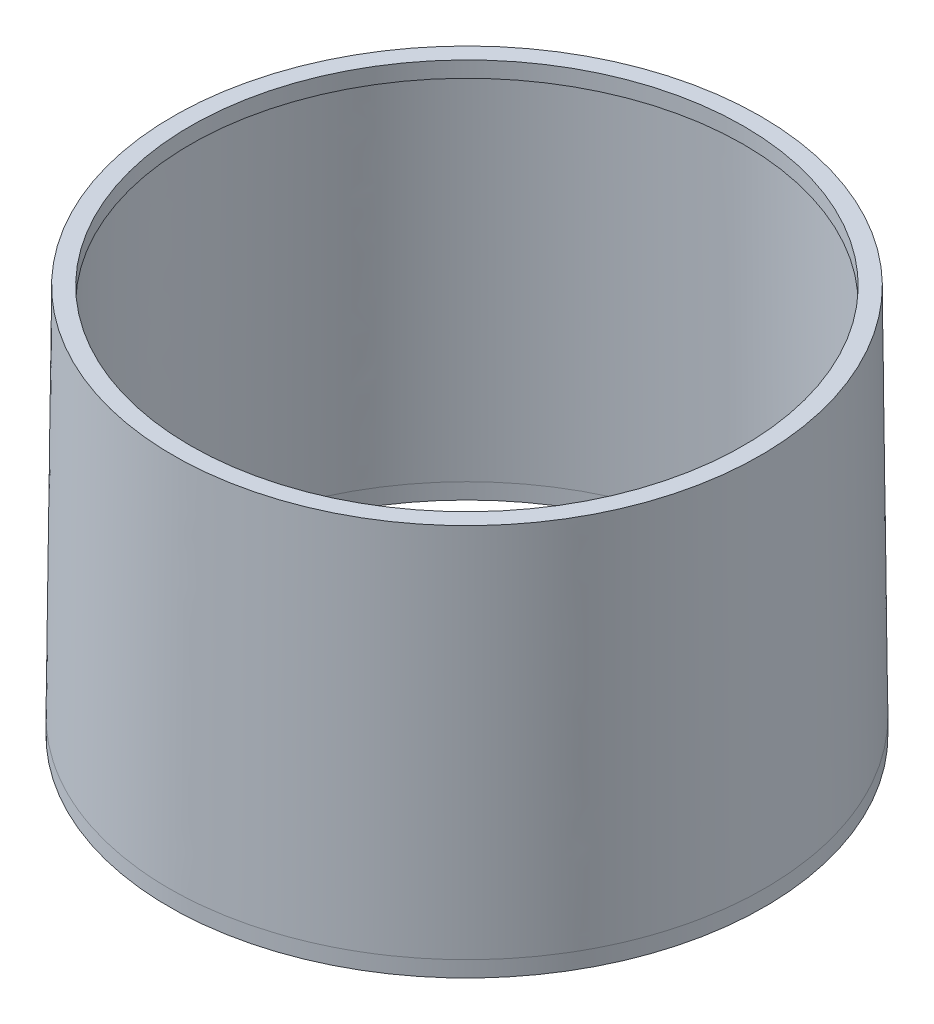
ISO-10303-21;
HEADER;
FILE_DESCRIPTION(('STEP AP214'),'2;1');
FILE_NAME('part.step','',(''),(''),'','','');
FILE_SCHEMA(('AUTOMOTIVE_DESIGN { 1 0 10303 214 1 1 1 1 }'));
ENDSEC;
DATA;
#1=APPLICATION_CONTEXT('core data for automotive mechanical design processes');
#2=APPLICATION_PROTOCOL_DEFINITION('international standard','automotive_design',2000,#1);
#3=PRODUCT_CONTEXT('',#1,'mechanical');
#4=PRODUCT('Part','Part','',(#3));
#5=PRODUCT_RELATED_PRODUCT_CATEGORY('part','',(#4));
#6=PRODUCT_DEFINITION_FORMATION('','',#4);
#7=PRODUCT_DEFINITION_CONTEXT('part definition',#1,'design');
#8=PRODUCT_DEFINITION('design','',#6,#7);
#9=PRODUCT_DEFINITION_SHAPE('','',#8);
#10=(LENGTH_UNIT() NAMED_UNIT(*) SI_UNIT(.MILLI.,.METRE.));
#11=(NAMED_UNIT(*) PLANE_ANGLE_UNIT() SI_UNIT($,.RADIAN.));
#12=(NAMED_UNIT(*) SI_UNIT($,.STERADIAN.) SOLID_ANGLE_UNIT());
#13=UNCERTAINTY_MEASURE_WITH_UNIT(LENGTH_MEASURE(1.E-05),#10,'distance_accuracy_value','');
#14=(GEOMETRIC_REPRESENTATION_CONTEXT(3) GLOBAL_UNCERTAINTY_ASSIGNED_CONTEXT((#13)) GLOBAL_UNIT_ASSIGNED_CONTEXT((#10,
#11,#12)) REPRESENTATION_CONTEXT('',''));
#15=CARTESIAN_POINT('',(0.,0.,0.));
#16=DIRECTION('',(0.,0.,1.));
#17=DIRECTION('',(1.,0.,0.));
#18=AXIS2_PLACEMENT_3D('',#15,#16,#17);
#19=CARTESIAN_POINT('',(0.,0.,-36.25));
#20=CARTESIAN_POINT('',(0.,15.6666666666667,-36.0833333333333));
#21=CARTESIAN_POINT('',(0.,31.3333333333333,-35.9166666666667));
#22=CARTESIAN_POINT('',(0.,47.,-35.75));
#23=CARTESIAN_POINT('',(-1.00034595548562,0.,-36.25));
#24=CARTESIAN_POINT('',(-0.995746663736257,15.6666666666667,-36.0833333333333));
#25=CARTESIAN_POINT('',(-0.991147371986893,31.3333333333333,-35.9166666666667));
#26=CARTESIAN_POINT('',(-0.986548080237529,47.,-35.75));
#27=CARTESIAN_POINT('',(-2.98221867535973,0.,-36.1687845955486));
#28=CARTESIAN_POINT('',(-2.96850732512818,15.6666666666667,-36.0024913330403));
#29=CARTESIAN_POINT('',(-2.95479597489664,31.3333333333333,-35.836198070532));
#30=CARTESIAN_POINT('',(-2.9410846246651,47.,-35.6699048080237));
#31=CARTESIAN_POINT('',(-5.88921074987639,0.,-35.8126747075202));
#32=CARTESIAN_POINT('',(-5.86213391884247,15.6666666666667,-35.6480187318535));
#33=CARTESIAN_POINT('',(-5.83505708780855,31.3333333333333,-35.4833627561867));
#34=CARTESIAN_POINT('',(-5.80798025677463,47.,-35.3187067805199));
#35=CARTESIAN_POINT('',(-8.72102638709538,0.,-35.2316374701439));
#36=CARTESIAN_POINT('',(-8.68092971405126,15.6666666666667,-35.0696529300513));
#37=CARTESIAN_POINT('',(-8.64083304100714,31.3333333333333,-34.9076683899587));
#38=CARTESIAN_POINT('',(-8.60073636796302,47.,-34.745683849866));
#39=CARTESIAN_POINT('',(-25.2047049946044,0.,-30.4520065418166));
#40=CARTESIAN_POINT('',(-25.0888212934798,15.6666666666667,-30.311997316337));
#41=CARTESIAN_POINT('',(-24.9729375923552,31.3333333333333,-30.1719880908573));
#42=CARTESIAN_POINT('',(-24.8570538912306,47.,-30.0319788653777));
#43=CARTESIAN_POINT('',(-36.25,0.,-16.0055352877699));
#44=CARTESIAN_POINT('',(-36.0833333333333,15.6666666666667,-15.9319466197801));
#45=CARTESIAN_POINT('',(-35.9166666666667,31.3333333333333,-15.8583579517904));
#46=CARTESIAN_POINT('',(-35.75,47.,-15.7847692838007));
#47=CARTESIAN_POINT('',(-36.25,0.,20.0069191097124));
#48=CARTESIAN_POINT('',(-36.0833333333333,15.6666666666667,19.9149332747252));
#49=CARTESIAN_POINT('',(-35.9166666666667,31.3333333333333,19.822947439738));
#50=CARTESIAN_POINT('',(-35.75,47.,19.7309616047508));
#51=CARTESIAN_POINT('',(-20.0069191097124,0.,36.25));
#52=CARTESIAN_POINT('',(-19.9149332747252,15.6666666666667,36.0833333333333));
#53=CARTESIAN_POINT('',(-19.822947439738,31.3333333333333,35.9166666666667));
#54=CARTESIAN_POINT('',(-19.7309616047508,47.,35.75));
#55=CARTESIAN_POINT('',(20.0069191097124,0.,36.25));
#56=CARTESIAN_POINT('',(19.9149332747252,15.6666666666667,36.0833333333333));
#57=CARTESIAN_POINT('',(19.822947439738,31.3333333333333,35.9166666666667));
#58=CARTESIAN_POINT('',(19.7309616047508,47.,35.75));
#59=CARTESIAN_POINT('',(36.25,0.,20.0069191097124));
#60=CARTESIAN_POINT('',(36.0833333333333,15.6666666666667,19.9149332747252));
#61=CARTESIAN_POINT('',(35.9166666666667,31.3333333333333,19.822947439738));
#62=CARTESIAN_POINT('',(35.75,47.,19.7309616047508));
#63=CARTESIAN_POINT('',(36.25,0.,-16.0055352877699));
#64=CARTESIAN_POINT('',(36.0833333333333,15.6666666666667,-15.9319466197801));
#65=CARTESIAN_POINT('',(35.9166666666667,31.3333333333333,-15.8583579517904));
#66=CARTESIAN_POINT('',(35.75,47.,-15.7847692838006));
#67=CARTESIAN_POINT('',(25.2047049946044,0.,-30.4520065418166));
#68=CARTESIAN_POINT('',(25.0888212934798,15.6666666666667,-30.311997316337));
#69=CARTESIAN_POINT('',(24.9729375923552,31.3333333333333,-30.1719880908573));
#70=CARTESIAN_POINT('',(24.8570538912306,47.,-30.0319788653777));
#71=CARTESIAN_POINT('',(8.72102638709537,0.,-35.2316374701439));
#72=CARTESIAN_POINT('',(8.68092971405126,15.6666666666667,-35.0696529300513));
#73=CARTESIAN_POINT('',(8.64083304100715,31.3333333333333,-34.9076683899587));
#74=CARTESIAN_POINT('',(8.60073636796304,47.,-34.745683849866));
#75=CARTESIAN_POINT('',(5.88921074987638,0.,-35.8126747075202));
#76=CARTESIAN_POINT('',(5.86213391884247,15.6666666666667,-35.6480187318535));
#77=CARTESIAN_POINT('',(5.83505708780856,31.3333333333333,-35.4833627561867));
#78=CARTESIAN_POINT('',(5.80798025677465,47.,-35.3187067805199));
#79=CARTESIAN_POINT('',(2.98221867535973,0.,-36.1687845955486));
#80=CARTESIAN_POINT('',(2.96850732512819,15.6666666666667,-36.0024913330403));
#81=CARTESIAN_POINT('',(2.95479597489666,31.3333333333333,-35.836198070532));
#82=CARTESIAN_POINT('',(2.94108462466512,47.,-35.6699048080237));
#83=CARTESIAN_POINT('',(1.00034595548561,0.,-36.25));
#84=CARTESIAN_POINT('',(0.995746663736256,15.6666666666667,-36.0833333333333));
#85=CARTESIAN_POINT('',(0.991147371986901,31.3333333333333,-35.9166666666667));
#86=CARTESIAN_POINT('',(0.986548080237547,47.,-35.75));
#87=CARTESIAN_POINT('',(0.,0.,-36.25));
#88=CARTESIAN_POINT('',(0.,15.6666666666667,-36.0833333333333));
#89=CARTESIAN_POINT('',(0.,31.3333333333333,-35.9166666666667));
#90=CARTESIAN_POINT('',(0.,47.,-35.75));
#91=B_SPLINE_SURFACE_WITH_KNOTS('',3,3,((#19,#20,#21,#22),(#23,#24,#25,#26),(#27,#28,#29,#30),
(#31,#32,#33,#34),(#35,#36,#37,#38),(#39,#40,#41,#42),(#43,#44,#45,#46),(#47,#48,#49,#50),(#51,
#52,#53,#54),(#55,#56,#57,#58),(#59,#60,#61,#62),(#63,#64,#65,#66),(#67,#68,#69,#70),(#71,#72,
#73,#74),(#75,#76,#77,#78),(#79,#80,#81,#82),(#83,#84,#85,#86),(#87,#88,#89,#90)),.UNSPECIFIED.,
.T.,.F.,.F.,(4,1,1,1,1,2,2,2,1,1,1,1,4),(4,4),(0.,0.0125,0.0249999999999999,0.0375000000000001,
0.05,0.25,0.5,0.75,0.95,0.9625,0.975,0.9875,1.),(0.,1.),.UNSPECIFIED.);
#92=CARTESIAN_POINT('',(0.,0.,0.));
#93=DIRECTION('',(0.,-1.,0.));
#94=DIRECTION('',(0.,0.,-1.));
#95=AXIS2_PLACEMENT_3D('',#92,#93,#94);
#96=CIRCLE('',#95,36.25);
#97=CARTESIAN_POINT('',(0.,0.,-36.25));
#98=VERTEX_POINT('',#97);
#99=EDGE_CURVE('E87',#98,#98,#96,.T.);
#100=CARTESIAN_POINT('',(0.,45.,-35.7712765957447));
#101=CARTESIAN_POINT('',(1.00268327297097,45.,-35.7712672482789));
#102=CARTESIAN_POINT('',(2.00555891194753,45.,-35.7298755760709));
#103=CARTESIAN_POINT('',(4.00447879009731,45.,-35.5633090180871));
#104=CARTESIAN_POINT('',(5.00052153068844,45.,-35.4381163115097));
#105=CARTESIAN_POINT('',(6.97932596875807,45.,-35.1039550668705));
#106=CARTESIAN_POINT('',(7.96207621909928,45.,-34.8949185506267));
#107=CARTESIAN_POINT('',(9.90626191561392,45.,-34.3942776134032));
#108=CARTESIAN_POINT('',(10.8676983871564,45.,-34.1026771737668));
#109=CARTESIAN_POINT('',(12.7621543891725,45.,-33.4391110720878));
#110=CARTESIAN_POINT('',(13.695180930956,45.,-33.0671654249495));
#111=CARTESIAN_POINT('',(15.5264707880152,45.,-32.2457519949071));
#112=CARTESIAN_POINT('',(16.4247335087031,45.,-31.7962828867869));
#113=CARTESIAN_POINT('',(18.1802554192831,45.,-30.8233231685317));
#114=CARTESIAN_POINT('',(19.0375134429979,45.,-30.2998304548318));
#115=CARTESIAN_POINT('',(20.7051191003035,45.,-29.182826729438));
#116=CARTESIAN_POINT('',(21.515466716205,45.,-28.5893156913414));
#117=CARTESIAN_POINT('',(23.0841316794345,45.,-27.3363263747606));
#118=CARTESIAN_POINT('',(23.842421730711,45.,-26.6768139276018));
#119=CARTESIAN_POINT('',(25.3012960896081,45.,-25.2967877151082));
#120=CARTESIAN_POINT('',(26.0018803521317,45.,-24.5762739021016));
#121=CARTESIAN_POINT('',(27.3403852398184,45.,-23.0793087999881));
#122=CARTESIAN_POINT('',(27.9783104080785,45.,-22.302861573419));
#123=CARTESIAN_POINT('',(29.1869510699031,45.,-20.6993030344744));
#124=CARTESIAN_POINT('',(29.7576665227961,45.,-19.8721916914403));
#125=CARTESIAN_POINT('',(30.8318895365229,45.,-18.1661799597468));
#126=CARTESIAN_POINT('',(31.3348256887682,45.,-17.2869195995408));
#127=CARTESIAN_POINT('',(32.2641454292197,45.,-15.4888144562046));
#128=CARTESIAN_POINT('',(32.690528149626,45.,-14.5699692244918));
#129=CARTESIAN_POINT('',(33.4633278462889,45.,-12.6992610382057));
#130=CARTESIAN_POINT('',(33.8097473654375,45.,-11.7473991346958));
#131=CARTESIAN_POINT('',(34.4199205075247,45.,-9.8176088436152));
#132=CARTESIAN_POINT('',(34.6836771603321,45.,-8.83968141285858));
#133=CARTESIAN_POINT('',(35.1241032008854,45.,-6.87635729226354));
#134=CARTESIAN_POINT('',(35.3017593855608,45.,-5.89118335740926));
#135=CARTESIAN_POINT('',(35.5057365571504,45.,-4.40510493920248));
#136=CARTESIAN_POINT('',(35.5633144744564,45.,-3.90829489497311));
#137=CARTESIAN_POINT('',(35.6576610455751,45.,-2.91266855040895));
#138=CARTESIAN_POINT('',(35.6944296355916,45.,-2.41385224392818));
#139=CARTESIAN_POINT('',(35.7472039220354,45.,-1.4150754458299));
#140=CARTESIAN_POINT('',(35.7632072032021,45.,-0.915114827888568));
#141=CARTESIAN_POINT('',(35.7746195000815,45.,0.0850412722900782));
#142=CARTESIAN_POINT('',(35.7700284731531,45.,0.585236755011541));
#143=CARTESIAN_POINT('',(35.7401674732893,45.,1.58501474425215));
#144=CARTESIAN_POINT('',(35.7148977699667,45.,2.08459725867825));
#145=CARTESIAN_POINT('',(35.6435651530256,45.,3.08224042700902));
#146=CARTESIAN_POINT('',(35.5975023219435,45.,3.58030108694663));
#147=CARTESIAN_POINT('',(35.426809267957,45.,5.08176003768266));
#148=CARTESIAN_POINT('',(35.2699856912254,45.,6.08170559096953));
#149=CARTESIAN_POINT('',(34.871666108839,45.,8.0644538982507));
#150=CARTESIAN_POINT('',(34.6301702858639,45.,9.04725668922555));
#151=CARTESIAN_POINT('',(34.0641625003815,45.,10.9884314152183));
#152=CARTESIAN_POINT('',(33.7396712215071,45.,11.9468093719053));
#153=CARTESIAN_POINT('',(33.0101261453923,45.,13.8323862024874));
#154=CARTESIAN_POINT('',(32.6050719790462,45.,14.7595849335096));
#155=CARTESIAN_POINT('',(31.7227920186063,45.,16.5656072774922));
#156=CARTESIAN_POINT('',(31.2464612022531,45.,17.4448683573997));
#157=CARTESIAN_POINT('',(30.2219149902807,45.,19.1604399379168));
#158=CARTESIAN_POINT('',(29.6737003510729,45.,19.9967508903484));
#159=CARTESIAN_POINT('',(28.5093081985359,45.,21.6209997999284));
#160=CARTESIAN_POINT('',(27.8931109734838,45.,22.4089236234753));
#161=CARTESIAN_POINT('',(26.5973259604125,45.,23.9308058053083));
#162=CARTESIAN_POINT('',(25.9177373915329,45.,24.6647634986355));
#163=CARTESIAN_POINT('',(24.4931258357728,45.,26.0804357688309));
#164=CARTESIAN_POINT('',(23.7475380703297,45.,26.7615821334928));
#165=CARTESIAN_POINT('',(22.2017975163181,45.,28.0588674304556));
#166=CARTESIAN_POINT('',(21.4016445734418,45.,28.6750061789056));
#167=CARTESIAN_POINT('',(19.75252210593,45.,29.8375685879348));
#168=CARTESIAN_POINT('',(18.9035660903368,45.,30.3840114073291));
#169=CARTESIAN_POINT('',(17.162504750289,45.,31.4032057615641));
#170=CARTESIAN_POINT('',(16.2703994586458,45.,31.8759573524395));
#171=CARTESIAN_POINT('',(14.449003233627,45.,32.7441907032163));
#172=CARTESIAN_POINT('',(13.5197009403793,45.,33.139648637532));
#173=CARTESIAN_POINT('',(11.6307924230111,45.,33.849982288611));
#174=CARTESIAN_POINT('',(10.6711866397622,45.,34.1648591771053));
#175=CARTESIAN_POINT('',(8.72843981947243,45.,34.7117188922537));
#176=CARTESIAN_POINT('',(7.7452934410205,45.,34.9436827118869));
#177=CARTESIAN_POINT('',(5.76269518015913,45.,35.3231443010584));
#178=CARTESIAN_POINT('',(4.7632431207078,45.,35.4706411528527));
#179=CARTESIAN_POINT('',(3.26269989759711,45.,35.6276849018945));
#180=CARTESIAN_POINT('',(2.76475767086533,45.,35.669282521333));
#181=CARTESIAN_POINT('',(1.76753926647279,45.,35.7317398715791));
#182=CARTESIAN_POINT('',(1.26826308201852,45.,35.7525994965706));
#183=CARTESIAN_POINT('',(0.26928235882832,45.,35.7737245329122));
#184=CARTESIAN_POINT('',(-0.230422182818892,45.,35.7739898031677));
#185=CARTESIAN_POINT('',(-1.2294178850245,45.,35.7539344339247));
#186=CARTESIAN_POINT('',(-1.72870904722208,45.,35.7336138764511));
#187=CARTESIAN_POINT('',(-2.72596221006656,45.,35.6722289343278));
#188=CARTESIAN_POINT('',(-3.22392437034812,45.,35.6311671652238));
#189=CARTESIAN_POINT('',(-4.21766443047692,45.,35.5282725138425));
#190=CARTESIAN_POINT('',(-4.7134423337131,45.,35.4664396638037));
#191=CARTESIAN_POINT('',(-6.19616202955415,45.,35.2497759200986));
#192=CARTESIAN_POINT('',(-7.17874292509017,45.,35.0637643280601));
#193=CARTESIAN_POINT('',(-9.13618946099252,45.,34.6068353831512));
#194=CARTESIAN_POINT('',(-10.1108237476704,45.,34.3349329611246));
#195=CARTESIAN_POINT('',(-12.0333752702051,45.,33.708868602204));
#196=CARTESIAN_POINT('',(-12.9812915403858,45.,33.3547036963402));
#197=CARTESIAN_POINT('',(-14.843518799885,45.,32.5668785523336));
#198=CARTESIAN_POINT('',(-15.7578284233616,45.,32.1332150874883));
#199=CARTESIAN_POINT('',(-17.5463204844043,45.,31.1898511101482));
#200=CARTESIAN_POINT('',(-18.420503433907,45.,30.6801515680754));
#201=CARTESIAN_POINT('',(-20.113485067664,45.,29.5945642000467));
#202=CARTESIAN_POINT('',(-20.9327783053669,45.,29.0194472122789));
#203=CARTESIAN_POINT('',(-22.520579721329,45.,27.8029423139503));
#204=CARTESIAN_POINT('',(-23.2890881624933,45.,27.1615547465059));
#205=CARTESIAN_POINT('',(-24.7701795926148,45.,25.8170082342817));
#206=CARTESIAN_POINT('',(-25.4827561803777,45.,25.1138422386487));
#207=CARTESIAN_POINT('',(-26.8469651195119,45.,23.6506769516385));
#208=CARTESIAN_POINT('',(-27.4985969210399,45.,22.8906771476184));
#209=CARTESIAN_POINT('',(-28.7435665265876,45.,21.309774379703));
#210=CARTESIAN_POINT('',(-29.3361286086834,45.,20.4882602625745));
#211=CARTESIAN_POINT('',(-30.4496645399643,45.,18.7980535351256));
#212=CARTESIAN_POINT('',(-30.9706379438466,45.,17.9293606313863));
#213=CARTESIAN_POINT('',(-31.9368181200345,45.,16.1510899140785));
#214=CARTESIAN_POINT('',(-32.3820441743277,45.,15.2415225801162));
#215=CARTESIAN_POINT('',(-33.1933483139518,45.,13.3877516962146));
#216=CARTESIAN_POINT('',(-33.559427254586,45.,12.4435485206966));
#217=CARTESIAN_POINT('',(-34.2071057516604,45.,10.5345321306723));
#218=CARTESIAN_POINT('',(-34.4893215445823,45.,9.56992802802558));
#219=CARTESIAN_POINT('',(-34.9709298137071,45.,7.62032061989736));
#220=CARTESIAN_POINT('',(-35.1703240222808,45.,6.63531774154752));
#221=CARTESIAN_POINT('',(-35.4852645374297,45.,4.65157688387483));
#222=CARTESIAN_POINT('',(-35.6007856286757,45.,3.652834865939));
#223=CARTESIAN_POINT('',(-35.711089429682,45.,2.15035768606514));
#224=CARTESIAN_POINT('',(-35.7373603465199,45.,1.64873619113305));
#225=CARTESIAN_POINT('',(-35.7690497566492,45.,0.644801838972487));
#226=CARTESIAN_POINT('',(-35.7744681070194,45.,0.142488977029064));
#227=CARTESIAN_POINT('',(-35.7645298250719,45.,-0.862448288821137));
#228=CARTESIAN_POINT('',(-35.7491518495525,45.,-1.36507248282284));
#229=CARTESIAN_POINT('',(-35.6974208176711,45.,-2.36920663389246));
#230=CARTESIAN_POINT('',(-35.6610679212568,45.,-2.87071659942783));
#231=CARTESIAN_POINT('',(-35.5204254641606,45.,-4.3722093466768));
#232=CARTESIAN_POINT('',(-35.3845495227726,45.,-5.36943241654234));
#233=CARTESIAN_POINT('',(-35.0289040740628,45.,-7.34834899966919));
#234=CARTESIAN_POINT('',(-34.8091616544515,45.,-8.33004742066861));
#235=CARTESIAN_POINT('',(-34.2870993564803,45.,-10.2712992185941));
#236=CARTESIAN_POINT('',(-33.984777635916,45.,-11.2308521009727));
#237=CARTESIAN_POINT('',(-33.3002037284413,45.,-13.1197086409259));
#238=CARTESIAN_POINT('',(-32.9180464444491,45.,-14.0490467134156));
#239=CARTESIAN_POINT('',(-32.076570136954,45.,-15.872098103212));
#240=CARTESIAN_POINT('',(-31.6172512315249,45.,-16.7658114750294));
#241=CARTESIAN_POINT('',(-30.6249211901388,45.,-18.5116014536464));
#242=CARTESIAN_POINT('',(-30.0918932971125,45.,-19.3636685327527));
#243=CARTESIAN_POINT('',(-28.956277386515,45.,-21.0201087868739));
#244=CARTESIAN_POINT('',(-28.3536890737955,45.,-21.8244817594985));
#245=CARTESIAN_POINT('',(-27.0832195253061,45.,-23.3802358922399));
#246=CARTESIAN_POINT('',(-26.4153214838394,45.,-24.1316033267351));
#247=CARTESIAN_POINT('',(-25.0191141361481,45.,-25.5759417111954));
#248=CARTESIAN_POINT('',(-24.290804690106,45.,-26.2689125259987));
#249=CARTESIAN_POINT('',(-22.7786948817903,45.,-27.5916985808104));
#250=CARTESIAN_POINT('',(-21.9948846811363,45.,-28.2215025754533));
#251=CARTESIAN_POINT('',(-20.3772683320035,45.,-29.4132371161149));
#252=CARTESIAN_POINT('',(-19.5434627844328,45.,-29.9751684776692));
#253=CARTESIAN_POINT('',(-17.8248285485805,45.,-31.0310773065218));
#254=CARTESIAN_POINT('',(-16.9396507497984,45.,-31.5244867890363));
#255=CARTESIAN_POINT('',(-15.1304458662006,45.,-32.434231471351));
#256=CARTESIAN_POINT('',(-14.206416197922,45.,-32.8505615357622));
#257=CARTESIAN_POINT('',(-12.3273339299527,45.,-33.6023294139051));
#258=CARTESIAN_POINT('',(-11.3723201305845,45.,-33.9378642808096));
#259=CARTESIAN_POINT('',(-9.43726810263149,45.,-34.5260325954055));
#260=CARTESIAN_POINT('',(-8.45723670486576,45.,-34.7786884169268));
#261=CARTESIAN_POINT('',(-6.85524662171826,45.,-35.1195189752907));
#262=CARTESIAN_POINT('',(-6.23869581427515,45.,-35.2337159426882));
#263=CARTESIAN_POINT('',(-5.00035258816594,45.,-35.4294521192495));
#264=CARTESIAN_POINT('',(-4.37855981758306,45.,-35.5109891176849));
#265=CARTESIAN_POINT('',(-3.131458114852,45.,-35.6413318760475));
#266=CARTESIAN_POINT('',(-2.50614864695192,45.,-35.6901325046183));
#267=CARTESIAN_POINT('',(-1.25391779477774,45.,-35.755106830374));
#268=CARTESIAN_POINT('',(-0.626996507189783,45.,-35.771282440889));
#269=CARTESIAN_POINT('',(0.,45.,-35.7712765957447));
#270=B_SPLINE_CURVE_WITH_KNOTS('',3,(#100,#101,#102,#103,#104,#105,#106,#107,#108,#109,#110,
#111,#112,#113,#114,#115,#116,#117,#118,#119,#120,#121,#122,#123,#124,#125,#126,#127,#128,#129,
#130,#131,#132,#133,#134,#135,#136,#137,#138,#139,#140,#141,#142,#143,#144,#145,#146,#147,#148,
#149,#150,#151,#152,#153,#154,#155,#156,#157,#158,#159,#160,#161,#162,#163,#164,#165,#166,#167,
#168,#169,#170,#171,#172,#173,#174,#175,#176,#177,#178,#179,#180,#181,#182,#183,#184,#185,#186,
#187,#188,#189,#190,#191,#192,#193,#194,#195,#196,#197,#198,#199,#200,#201,#202,#203,#204,#205,
#206,#207,#208,#209,#210,#211,#212,#213,#214,#215,#216,#217,#218,#219,#220,#221,#222,#223,#224,
#225,#226,#227,#228,#229,#230,#231,#232,#233,#234,#235,#236,#237,#238,#239,#240,#241,#242,#243,
#244,#245,#246,#247,#248,#249,#250,#251,#252,#253,#254,#255,#256,#257,#258,#259,#260,#261,#262,
#263,#264,#265,#266,#267,#268,#269),.UNSPECIFIED.,.T.,.F.,(4,2,2,2,2,2,2,2,2,2,2,2,2,2,2,2,2,2,
2,2,2,2,2,2,2,2,2,2,2,2,2,2,2,2,2,2,2,2,2,2,2,2,2,2,2,2,2,2,2,2,2,2,2,2,2,2,2,2,2,2,2,2,2,2,2,2,
2,2,2,2,2,2,2,2,2,2,2,2,2,2,2,2,2,2,4),(0.,3.00749787139823,6.01563550885013,9.02621700494149,
12.0366533514705,15.0463406271618,18.0560793567121,21.0659036326665,24.0757290435715,
27.0871207701542,30.0985148501198,33.109690427571,36.1208678272028,39.1560249467773,
42.1912164703348,45.2263114591438,48.261295188627,51.2606202430365,52.7606679970809,
54.2607203498684,55.760947161544,57.2611770794836,58.7613874374397,60.2615918405108,
63.2941016391322,66.3266048951802,69.3583531439588,72.390115283268,75.3865869917424,
78.3830271717956,81.3803384720779,84.377686698393,87.4037659361667,90.4298537319047,
93.4551078808731,96.4803597294379,99.5065426390748,102.532681542413,105.559513714658,
108.586378773182,110.085056532584,111.583741938978,113.082437613068,114.581127315587,
116.07962807479,117.578126508203,120.574364998651,123.606297138825,126.638338722743,
129.670503398997,132.702629380101,135.702143815178,138.701642721019,141.701484409435,
144.701353159791,147.736503031497,150.771671781877,153.806066750232,156.840428925752,
159.851909162875,162.863326405991,165.875648616908,167.382218919351,168.888799547632,
170.396927548699,171.905044049445,174.920447322631,177.934877485416,180.949374900524,
183.960309077791,186.971238647735,189.982853853992,192.994481839148,196.006886835139,
199.019298803301,202.032246112115,205.04515721472,208.081716494665,211.118478011558,
214.151573292258,217.183849090631,219.06418182521,220.944641816585,222.825396497235,
224.706040875753),.UNSPECIFIED.);
#271=CARTESIAN_POINT('',(0.,45.,-35.7712765957447));
#272=VERTEX_POINT('',#271);
#273=EDGE_CURVE('E12',#272,#272,#270,.T.);
#274=CARTESIAN_POINT('',(0.,0.,-36.25));
#275=CARTESIAN_POINT('',(0.,0.46875,-36.2450132978723));
#276=CARTESIAN_POINT('',(0.,0.9375,-36.2400265957447));
#277=CARTESIAN_POINT('',(0.,1.875,-36.2300531914893));
#278=CARTESIAN_POINT('',(0.,2.34375,-36.2250664893617));
#279=CARTESIAN_POINT('',(0.,3.28125,-36.2150930851064));
#280=CARTESIAN_POINT('',(0.,3.75,-36.2101063829787));
#281=CARTESIAN_POINT('',(0.,4.6875,-36.2001329787234));
#282=CARTESIAN_POINT('',(0.,5.15625,-36.1951462765957));
#283=CARTESIAN_POINT('',(0.,6.09375,-36.1851728723404));
#284=CARTESIAN_POINT('',(0.,6.5625,-36.1801861702127));
#285=CARTESIAN_POINT('',(0.,7.5,-36.1702127659574));
#286=CARTESIAN_POINT('',(0.,7.96875,-36.1652260638298));
#287=CARTESIAN_POINT('',(0.,8.90625,-36.1552526595745));
#288=CARTESIAN_POINT('',(0.,9.375,-36.1502659574468));
#289=CARTESIAN_POINT('',(0.,10.3125,-36.1402925531915));
#290=CARTESIAN_POINT('',(0.,10.78125,-36.1353058510638));
#291=CARTESIAN_POINT('',(0.,11.71875,-36.1253324468085));
#292=CARTESIAN_POINT('',(0.,12.1875,-36.1203457446808));
#293=CARTESIAN_POINT('',(0.,13.125,-36.1103723404255));
#294=CARTESIAN_POINT('',(0.,13.59375,-36.1053856382979));
#295=CARTESIAN_POINT('',(0.,14.53125,-36.0954122340425));
#296=CARTESIAN_POINT('',(0.,15.,-36.0904255319149));
#297=CARTESIAN_POINT('',(0.,15.9375,-36.0804521276596));
#298=CARTESIAN_POINT('',(0.,16.40625,-36.0754654255319));
#299=CARTESIAN_POINT('',(0.,17.34375,-36.0654920212766));
#300=CARTESIAN_POINT('',(0.,17.8125,-36.0605053191489));
#301=CARTESIAN_POINT('',(0.,18.75,-36.0505319148936));
#302=CARTESIAN_POINT('',(0.,19.21875,-36.0455452127659));
#303=CARTESIAN_POINT('',(0.,20.15625,-36.0355718085106));
#304=CARTESIAN_POINT('',(0.,20.625,-36.030585106383));
#305=CARTESIAN_POINT('',(0.,21.5625,-36.0206117021277));
#306=CARTESIAN_POINT('',(0.,22.03125,-36.015625));
#307=CARTESIAN_POINT('',(0.,22.96875,-36.0056515957447));
#308=CARTESIAN_POINT('',(0.,23.4375,-36.000664893617));
#309=CARTESIAN_POINT('',(0.,24.375,-35.9906914893617));
#310=CARTESIAN_POINT('',(0.,24.84375,-35.985704787234));
#311=CARTESIAN_POINT('',(0.,25.78125,-35.9757313829787));
#312=CARTESIAN_POINT('',(0.,26.25,-35.9707446808511));
#313=CARTESIAN_POINT('',(0.,27.1875,-35.9607712765957));
#314=CARTESIAN_POINT('',(0.,27.65625,-35.9557845744681));
#315=CARTESIAN_POINT('',(0.,28.59375,-35.9458111702128));
#316=CARTESIAN_POINT('',(0.,29.0625,-35.9408244680851));
#317=CARTESIAN_POINT('',(0.,30.,-35.9308510638298));
#318=CARTESIAN_POINT('',(0.,30.46875,-35.9258643617021));
#319=CARTESIAN_POINT('',(0.,31.40625,-35.9158909574468));
#320=CARTESIAN_POINT('',(0.,31.875,-35.9109042553191));
#321=CARTESIAN_POINT('',(0.,32.8125,-35.9009308510638));
#322=CARTESIAN_POINT('',(0.,33.28125,-35.8959441489362));
#323=CARTESIAN_POINT('',(0.,34.21875,-35.8859707446808));
#324=CARTESIAN_POINT('',(0.,34.6875,-35.8809840425532));
#325=CARTESIAN_POINT('',(0.,35.625,-35.8710106382979));
#326=CARTESIAN_POINT('',(0.,36.09375,-35.8660239361702));
#327=CARTESIAN_POINT('',(0.,37.03125,-35.8560505319149));
#328=CARTESIAN_POINT('',(0.,37.5,-35.8510638297872));
#329=CARTESIAN_POINT('',(0.,38.4375,-35.8410904255319));
#330=CARTESIAN_POINT('',(0.,38.90625,-35.8361037234042));
#331=CARTESIAN_POINT('',(0.,39.84375,-35.8261303191489));
#332=CARTESIAN_POINT('',(0.,40.3125,-35.8211436170213));
#333=CARTESIAN_POINT('',(0.,41.25,-35.811170212766));
#334=CARTESIAN_POINT('',(0.,41.71875,-35.8061835106383));
#335=CARTESIAN_POINT('',(0.,42.65625,-35.796210106383));
#336=CARTESIAN_POINT('',(0.,43.125,-35.7912234042553));
#337=CARTESIAN_POINT('',(0.,44.0625,-35.78125));
#338=CARTESIAN_POINT('',(0.,44.53125,-35.7762632978723));
#339=CARTESIAN_POINT('',(0.,45.,-35.7712765957447));
#340=B_SPLINE_CURVE_WITH_KNOTS('',3,(#274,#275,#276,#277,#278,#279,#280,#281,#282,#283,#284,
#285,#286,#287,#288,#289,#290,#291,#292,#293,#294,#295,#296,#297,#298,#299,#300,#301,#302,#303,
#304,#305,#306,#307,#308,#309,#310,#311,#312,#313,#314,#315,#316,#317,#318,#319,#320,#321,#322,
#323,#324,#325,#326,#327,#328,#329,#330,#331,#332,#333,#334,#335,#336,#337,#338,#339),
.UNSPECIFIED.,.F.,.F.,(4,2,2,2,2,2,2,2,2,2,2,2,2,2,2,2,2,2,2,2,2,2,2,2,2,2,2,2,2,2,2,2,4),(0.,
1.40632957278264,2.81265914556527,4.21898871834791,5.62531829113054,7.03164786391318,
8.43797743669581,9.84430700947845,11.2506365822611,12.6569661550437,14.0632957278264,
15.469625300609,16.8759548733916,18.2822844461743,19.6886140189569,21.0949435917395,
22.5012731645222,23.9076027373048,25.3139323100874,26.7202618828701,28.1265914556527,
29.5329210284353,30.939250601218,32.3455801740006,33.7519097467832,35.1582393195659,
36.5645688923485,37.9708984651311,39.3772280379138,40.7835576106964,42.189887183479,
43.5962167562617,45.0025463290443),.UNSPECIFIED.);
#341=EDGE_CURVE('BSEAM80',#98,#272,#340,.T.);
#342=ORIENTED_EDGE('',*,*,#99,.T.);
#343=ORIENTED_EDGE('',*,*,#273,.F.);
#344=ORIENTED_EDGE('',*,*,#341,.T.);
#345=ORIENTED_EDGE('',*,*,#341,.F.);
#346=EDGE_LOOP('',(#342,#344,#343,#345));
#347=FACE_BOUND('',#346,.T.);
#348=ADVANCED_FACE('F80',(#347),#91,.F.);
#349=CARTESIAN_POINT('',(0.,47.,0.));
#350=DIRECTION('',(0.,1.,0.));
#351=DIRECTION('',(0.,0.,1.));
#352=AXIS2_PLACEMENT_3D('',#349,#350,#351);
#353=PLANE('',#352);
#354=CARTESIAN_POINT('',(0.,47.,0.));
#355=DIRECTION('',(0.,1.,0.));
#356=DIRECTION('',(0.,0.,1.));
#357=AXIS2_PLACEMENT_3D('',#354,#355,#356);
#358=CIRCLE('',#357,37.);
#359=CARTESIAN_POINT('',(0.,47.,-37.));
#360=VERTEX_POINT('',#359);
#361=EDGE_CURVE('E92',#360,#360,#358,.T.);
#362=ORIENTED_EDGE('',*,*,#361,.T.);
#363=EDGE_LOOP('',(#362));
#364=FACE_BOUND('',#363,.T.);
#365=CARTESIAN_POINT('',(0.,47.,0.));
#366=DIRECTION('',(0.,1.,0.));
#367=DIRECTION('',(0.,0.,1.));
#368=AXIS2_PLACEMENT_3D('',#365,#366,#367);
#369=CIRCLE('',#368,34.85);
#370=CARTESIAN_POINT('',(0.,47.,34.85));
#371=VERTEX_POINT('',#370);
#372=EDGE_CURVE('E142',#371,#371,#369,.T.);
#373=ORIENTED_EDGE('',*,*,#372,.F.);
#374=EDGE_LOOP('',(#373));
#375=FACE_BOUND('',#374,.T.);
#376=ADVANCED_FACE('F185',(#364,#375),#353,.T.);
#377=CARTESIAN_POINT('',(0.,47.,-37.));
#378=CARTESIAN_POINT('',(0.,31.3333333333333,-37.1666666666667));
#379=CARTESIAN_POINT('',(0.,15.6666666666667,-37.3333333333333));
#380=CARTESIAN_POINT('',(0.,0.,-37.5));
#381=CARTESIAN_POINT('',(1.02104276835774,47.,-37.));
#382=CARTESIAN_POINT('',(1.0256420601071,31.3333333333333,-37.1666666666667));
#383=CARTESIAN_POINT('',(1.03024135185646,15.6666666666667,-37.3333333333333));
#384=CARTESIAN_POINT('',(1.03484064360582,0.,-37.5));
#385=CARTESIAN_POINT('',(3.04391975140166,47.,-36.9171042768358));
#386=CARTESIAN_POINT('',(3.0576311016332,31.3333333333333,-37.083397539344));
#387=CARTESIAN_POINT('',(3.07134245186474,15.6666666666667,-37.2496908018523));
#388=CARTESIAN_POINT('',(3.08505380209627,0.,-37.4159840643606));
#389=CARTESIAN_POINT('',(6.01105648952901,47.,-36.5536265980206));
#390=CARTESIAN_POINT('',(6.03813332056292,31.3333333333333,-36.7182825736874));
#391=CARTESIAN_POINT('',(6.06521015159684,15.6666666666667,-36.8829385493542));
#392=CARTESIAN_POINT('',(6.09228698263075,0.,-37.0475945250209));
#393=CARTESIAN_POINT('',(8.90146141579391,47.,-35.9605679005607));
#394=CARTESIAN_POINT('',(8.94155808883803,31.3333333333333,-36.1225524406533));
#395=CARTESIAN_POINT('',(8.98165476188215,15.6666666666667,-36.2845369807459));
#396=CARTESIAN_POINT('',(9.02175143492626,0.,-36.4465215208385));
#397=CARTESIAN_POINT('',(25.7261816496652,47.,-31.0820480564748));
#398=CARTESIAN_POINT('',(25.8420653507898,31.3333333333333,-31.2220572819545));
#399=CARTESIAN_POINT('',(25.9579490519145,15.6666666666667,-31.3620665074341));
#400=CARTESIAN_POINT('',(26.0738327530391,0.,-31.5020757329137));
#401=CARTESIAN_POINT('',(37.,47.,-16.3366842937237));
#402=CARTESIAN_POINT('',(37.1666666666667,31.3333333333333,-16.4102729617135));
#403=CARTESIAN_POINT('',(37.3333333333334,15.6666666666667,-16.4838616297032));
#404=CARTESIAN_POINT('',(37.5,0.,-16.557450297693));
#405=CARTESIAN_POINT('',(37.,47.,20.4208553671547));
#406=CARTESIAN_POINT('',(37.1666666666667,31.3333333333333,20.5128412021419));
#407=CARTESIAN_POINT('',(37.3333333333333,15.6666666666667,20.6048270371291));
#408=CARTESIAN_POINT('',(37.5,0.,20.6968128721163));
#409=CARTESIAN_POINT('',(20.4208553671547,47.,37.));
#410=CARTESIAN_POINT('',(20.5128412021419,31.3333333333333,37.1666666666667));
#411=CARTESIAN_POINT('',(20.6048270371291,15.6666666666667,37.3333333333333));
#412=CARTESIAN_POINT('',(20.6968128721163,0.,37.5));
#413=CARTESIAN_POINT('',(-20.4208553671547,47.,37.));
#414=CARTESIAN_POINT('',(-20.5128412021419,31.3333333333333,37.1666666666667));
#415=CARTESIAN_POINT('',(-20.6048270371291,15.6666666666667,37.3333333333333));
#416=CARTESIAN_POINT('',(-20.6968128721163,0.,37.5));
#417=CARTESIAN_POINT('',(-37.,47.,20.4208553671547));
#418=CARTESIAN_POINT('',(-37.1666666666667,31.3333333333333,20.5128412021419));
#419=CARTESIAN_POINT('',(-37.3333333333333,15.6666666666667,20.6048270371291));
#420=CARTESIAN_POINT('',(-37.5,0.,20.6968128721163));
#421=CARTESIAN_POINT('',(-37.,47.,-16.3366842937238));
#422=CARTESIAN_POINT('',(-37.1666666666667,31.3333333333333,-16.4102729617135));
#423=CARTESIAN_POINT('',(-37.3333333333333,15.6666666666667,-16.4838616297033));
#424=CARTESIAN_POINT('',(-37.5,0.,-16.557450297693));
#425=CARTESIAN_POINT('',(-25.7261816496652,47.,-31.0820480564749));
#426=CARTESIAN_POINT('',(-25.8420653507898,31.3333333333333,-31.2220572819545));
#427=CARTESIAN_POINT('',(-25.9579490519144,15.6666666666667,-31.3620665074341));
#428=CARTESIAN_POINT('',(-26.0738327530391,0.,-31.5020757329137));
#429=CARTESIAN_POINT('',(-8.90146141579389,47.,-35.9605679005607));
#430=CARTESIAN_POINT('',(-8.94155808883801,31.3333333333333,-36.1225524406533));
#431=CARTESIAN_POINT('',(-8.98165476188213,15.6666666666667,-36.2845369807459));
#432=CARTESIAN_POINT('',(-9.02175143492625,0.,-36.4465215208385));
#433=CARTESIAN_POINT('',(-6.01105648952899,47.,-36.5536265980206));
#434=CARTESIAN_POINT('',(-6.0381333205629,31.3333333333333,-36.7182825736874));
#435=CARTESIAN_POINT('',(-6.06521015159682,15.6666666666667,-36.8829385493542));
#436=CARTESIAN_POINT('',(-6.09228698263073,0.,-37.0475945250209));
#437=CARTESIAN_POINT('',(-3.04391975140165,47.,-36.9171042768358));
#438=CARTESIAN_POINT('',(-3.05763110163319,31.3333333333333,-37.083397539344));
#439=CARTESIAN_POINT('',(-3.07134245186473,15.6666666666667,-37.2496908018523));
#440=CARTESIAN_POINT('',(-3.08505380209627,0.,-37.4159840643606));
#441=CARTESIAN_POINT('',(-1.02104276835772,47.,-37.));
#442=CARTESIAN_POINT('',(-1.02564206010708,31.3333333333333,-37.1666666666667));
#443=CARTESIAN_POINT('',(-1.03024135185644,15.6666666666667,-37.3333333333333));
#444=CARTESIAN_POINT('',(-1.0348406436058,0.,-37.5));
#445=CARTESIAN_POINT('',(0.,47.,-37.));
#446=CARTESIAN_POINT('',(0.,31.3333333333333,-37.1666666666667));
#447=CARTESIAN_POINT('',(0.,15.6666666666667,-37.3333333333333));
#448=CARTESIAN_POINT('',(0.,0.,-37.5));
#449=B_SPLINE_SURFACE_WITH_KNOTS('',3,3,((#377,#378,#379,#380),(#381,#382,#383,#384),(#385,#386,
#387,#388),(#389,#390,#391,#392),(#393,#394,#395,#396),(#397,#398,#399,#400),(#401,#402,#403,
#404),(#405,#406,#407,#408),(#409,#410,#411,#412),(#413,#414,#415,#416),(#417,#418,#419,#420),
(#421,#422,#423,#424),(#425,#426,#427,#428),(#429,#430,#431,#432),(#433,#434,#435,#436),(#437,
#438,#439,#440),(#441,#442,#443,#444),(#445,#446,#447,#448)),.UNSPECIFIED.,.T.,.F.,.F.,(4,1,1,1,
1,2,2,2,1,1,1,1,4),(4,4),(0.,0.0125,0.0249999999999999,0.0375000000000001,0.05,0.25,0.5,0.75,
0.95,0.9625,0.975,0.9875,1.),(0.,1.),.UNSPECIFIED.);
#450=CARTESIAN_POINT('',(0.,0.,0.));
#451=DIRECTION('',(0.,1.,0.));
#452=DIRECTION('',(0.,0.,1.));
#453=AXIS2_PLACEMENT_3D('',#450,#451,#452);
#454=CIRCLE('',#453,37.5);
#455=CARTESIAN_POINT('',(0.,0.,-37.5));
#456=VERTEX_POINT('',#455);
#457=EDGE_CURVE('E107',#456,#456,#454,.T.);
#458=CARTESIAN_POINT('',(0.,47.,-37.));
#459=CARTESIAN_POINT('',(0.,46.5104166666667,-37.0052083333333));
#460=CARTESIAN_POINT('',(0.,46.0208333333333,-37.0104166666667));
#461=CARTESIAN_POINT('',(0.,45.0416666666667,-37.0208333333333));
#462=CARTESIAN_POINT('',(0.,44.5520833333333,-37.0260416666667));
#463=CARTESIAN_POINT('',(0.,43.5729166666667,-37.0364583333333));
#464=CARTESIAN_POINT('',(0.,43.0833333333333,-37.0416666666667));
#465=CARTESIAN_POINT('',(0.,42.1041666666667,-37.0520833333333));
#466=CARTESIAN_POINT('',(0.,41.6145833333333,-37.0572916666667));
#467=CARTESIAN_POINT('',(0.,40.6354166666667,-37.0677083333333));
#468=CARTESIAN_POINT('',(0.,40.1458333333333,-37.0729166666667));
#469=CARTESIAN_POINT('',(0.,39.1666666666667,-37.0833333333333));
#470=CARTESIAN_POINT('',(0.,38.6770833333333,-37.0885416666667));
#471=CARTESIAN_POINT('',(0.,37.6979166666667,-37.0989583333333));
#472=CARTESIAN_POINT('',(0.,37.2083333333333,-37.1041666666667));
#473=CARTESIAN_POINT('',(0.,36.2291666666667,-37.1145833333333));
#474=CARTESIAN_POINT('',(0.,35.7395833333333,-37.1197916666667));
#475=CARTESIAN_POINT('',(0.,34.7604166666667,-37.1302083333333));
#476=CARTESIAN_POINT('',(0.,34.2708333333333,-37.1354166666667));
#477=CARTESIAN_POINT('',(0.,33.2916666666667,-37.1458333333333));
#478=CARTESIAN_POINT('',(0.,32.8020833333333,-37.1510416666667));
#479=CARTESIAN_POINT('',(0.,31.8229166666667,-37.1614583333333));
#480=CARTESIAN_POINT('',(0.,31.3333333333333,-37.1666666666667));
#481=CARTESIAN_POINT('',(0.,30.3541666666667,-37.1770833333333));
#482=CARTESIAN_POINT('',(0.,29.8645833333333,-37.1822916666667));
#483=CARTESIAN_POINT('',(0.,28.8854166666667,-37.1927083333333));
#484=CARTESIAN_POINT('',(0.,28.3958333333333,-37.1979166666667));
#485=CARTESIAN_POINT('',(0.,27.4166666666667,-37.2083333333333));
#486=CARTESIAN_POINT('',(0.,26.9270833333333,-37.2135416666667));
#487=CARTESIAN_POINT('',(0.,25.9479166666667,-37.2239583333333));
#488=CARTESIAN_POINT('',(0.,25.4583333333333,-37.2291666666667));
#489=CARTESIAN_POINT('',(0.,24.4791666666667,-37.2395833333333));
#490=CARTESIAN_POINT('',(0.,23.9895833333333,-37.2447916666667));
#491=CARTESIAN_POINT('',(0.,23.0104166666667,-37.2552083333333));
#492=CARTESIAN_POINT('',(0.,22.5208333333333,-37.2604166666667));
#493=CARTESIAN_POINT('',(0.,21.5416666666667,-37.2708333333333));
#494=CARTESIAN_POINT('',(0.,21.0520833333333,-37.2760416666667));
#495=CARTESIAN_POINT('',(0.,20.0729166666667,-37.2864583333333));
#496=CARTESIAN_POINT('',(0.,19.5833333333333,-37.2916666666667));
#497=CARTESIAN_POINT('',(0.,18.6041666666667,-37.3020833333333));
#498=CARTESIAN_POINT('',(0.,18.1145833333333,-37.3072916666667));
#499=CARTESIAN_POINT('',(0.,17.1354166666667,-37.3177083333333));
#500=CARTESIAN_POINT('',(0.,16.6458333333333,-37.3229166666667));
#501=CARTESIAN_POINT('',(0.,15.6666666666667,-37.3333333333333));
#502=CARTESIAN_POINT('',(0.,15.1770833333333,-37.3385416666667));
#503=CARTESIAN_POINT('',(0.,14.1979166666667,-37.3489583333333));
#504=CARTESIAN_POINT('',(0.,13.7083333333333,-37.3541666666667));
#505=CARTESIAN_POINT('',(0.,12.7291666666667,-37.3645833333333));
#506=CARTESIAN_POINT('',(0.,12.2395833333333,-37.3697916666667));
#507=CARTESIAN_POINT('',(0.,11.2604166666667,-37.3802083333333));
#508=CARTESIAN_POINT('',(0.,10.7708333333333,-37.3854166666667));
#509=CARTESIAN_POINT('',(0.,9.79166666666667,-37.3958333333333));
#510=CARTESIAN_POINT('',(0.,9.30208333333333,-37.4010416666667));
#511=CARTESIAN_POINT('',(0.,8.32291666666667,-37.4114583333333));
#512=CARTESIAN_POINT('',(0.,7.83333333333333,-37.4166666666667));
#513=CARTESIAN_POINT('',(0.,6.85416666666667,-37.4270833333333));
#514=CARTESIAN_POINT('',(0.,6.36458333333333,-37.4322916666667));
#515=CARTESIAN_POINT('',(0.,5.38541666666667,-37.4427083333333));
#516=CARTESIAN_POINT('',(0.,4.89583333333333,-37.4479166666667));
#517=CARTESIAN_POINT('',(0.,3.91666666666667,-37.4583333333333));
#518=CARTESIAN_POINT('',(0.,3.42708333333333,-37.4635416666667));
#519=CARTESIAN_POINT('',(0.,2.44791666666667,-37.4739583333333));
#520=CARTESIAN_POINT('',(0.,1.95833333333333,-37.4791666666667));
#521=CARTESIAN_POINT('',(0.,0.979166666666667,-37.4895833333333));
#522=CARTESIAN_POINT('',(0.,0.489583333333334,-37.4947916666667));
#523=CARTESIAN_POINT('',(0.,0.,-37.5));
#524=B_SPLINE_CURVE_WITH_KNOTS('',3,(#458,#459,#460,#461,#462,#463,#464,#465,#466,#467,#468,
#469,#470,#471,#472,#473,#474,#475,#476,#477,#478,#479,#480,#481,#482,#483,#484,#485,#486,#487,
#488,#489,#490,#491,#492,#493,#494,#495,#496,#497,#498,#499,#500,#501,#502,#503,#504,#505,#506,
#507,#508,#509,#510,#511,#512,#513,#514,#515,#516,#517,#518,#519,#520,#521,#522,#523),
.UNSPECIFIED.,.F.,.F.,(4,2,2,2,2,2,2,2,2,2,2,2,2,2,2,2,2,2,2,2,2,2,2,2,2,2,2,2,2,2,2,2,4),(0.,
1.46883310935075,2.9376662187015,4.40649932805226,5.87533243740302,7.34416554675376,
8.81299865610452,10.2818317654553,11.750664874806,13.2194979841568,14.6883310935075,
16.1571642028583,17.625997312209,19.0948304215598,20.5636635309105,22.0324966402613,
23.501329749612,24.9701628589628,26.4389959683135,27.9078290776643,29.376662187015,
30.8454952963658,32.3143284057165,33.7831615150673,35.2519946244181,36.7208277337688,
38.1896608431196,39.6584939524703,41.1273270618211,42.5961601711718,44.0649932805226,
45.5338263898733,47.0026594992241),.UNSPECIFIED.);
#525=EDGE_CURVE('BSEAM82',#360,#456,#524,.T.);
#526=ORIENTED_EDGE('',*,*,#361,.F.);
#527=ORIENTED_EDGE('',*,*,#457,.T.);
#528=ORIENTED_EDGE('',*,*,#525,.T.);
#529=ORIENTED_EDGE('',*,*,#525,.F.);
#530=EDGE_LOOP('',(#526,#528,#527,#529));
#531=FACE_BOUND('',#530,.T.);
#532=ADVANCED_FACE('F82',(#531),#449,.T.);
#533=CARTESIAN_POINT('',(0.,45.,0.));
#534=DIRECTION('',(0.,1.,0.));
#535=DIRECTION('',(0.,0.,1.));
#536=AXIS2_PLACEMENT_3D('',#533,#534,#535);
#537=PLANE('',#536);
#538=CARTESIAN_POINT('',(0.,45.,0.));
#539=DIRECTION('',(0.,1.,0.));
#540=DIRECTION('',(0.,0.,1.));
#541=AXIS2_PLACEMENT_3D('',#538,#539,#540);
#542=CIRCLE('',#541,34.85);
#543=CARTESIAN_POINT('',(0.,45.,34.85));
#544=VERTEX_POINT('',#543);
#545=EDGE_CURVE('E97',#544,#544,#542,.T.);
#546=ORIENTED_EDGE('',*,*,#545,.T.);
#547=EDGE_LOOP('',(#546));
#548=FACE_BOUND('',#547,.T.);
#549=ORIENTED_EDGE('',*,*,#273,.T.);
#550=EDGE_LOOP('',(#549));
#551=FACE_BOUND('',#550,.T.);
#552=ADVANCED_FACE('F111',(#548,#551),#537,.F.);
#553=CARTESIAN_POINT('',(0.,45.,0.));
#554=DIRECTION('',(0.,1.,0.));
#555=DIRECTION('',(0.,0.,1.));
#556=AXIS2_PLACEMENT_3D('',#553,#554,#555);
#557=CYLINDRICAL_SURFACE('',#556,34.85);
#558=ORIENTED_EDGE('',*,*,#545,.F.);
#559=EDGE_LOOP('',(#558));
#560=FACE_BOUND('',#559,.T.);
#561=ORIENTED_EDGE('',*,*,#372,.T.);
#562=EDGE_LOOP('',(#561));
#563=FACE_BOUND('',#562,.T.);
#564=ADVANCED_FACE('F115',(#560,#563),#557,.F.);
#565=CARTESIAN_POINT('',(0.,-2.,0.));
#566=DIRECTION('',(0.,-1.,0.));
#567=DIRECTION('',(0.,0.,-1.));
#568=AXIS2_PLACEMENT_3D('',#565,#566,#567);
#569=PLANE('',#568);
#570=CARTESIAN_POINT('',(0.,-2.,0.));
#571=DIRECTION('',(0.,-1.,0.));
#572=DIRECTION('',(0.,0.,-1.));
#573=AXIS2_PLACEMENT_3D('',#570,#571,#572);
#574=CIRCLE('',#573,37.5);
#575=CARTESIAN_POINT('',(0.,-2.,-37.5));
#576=VERTEX_POINT('',#575);
#577=EDGE_CURVE('E145',#576,#576,#574,.T.);
#578=ORIENTED_EDGE('',*,*,#577,.T.);
#579=EDGE_LOOP('',(#578));
#580=FACE_BOUND('',#579,.T.);
#581=CARTESIAN_POINT('',(0.,-2.,0.));
#582=DIRECTION('',(0.,-1.,0.));
#583=DIRECTION('',(0.,0.,-1.));
#584=AXIS2_PLACEMENT_3D('',#581,#582,#583);
#585=CIRCLE('',#584,36.25);
#586=CARTESIAN_POINT('',(0.,-2.,-36.25));
#587=VERTEX_POINT('',#586);
#588=EDGE_CURVE('E255',#587,#587,#585,.T.);
#589=ORIENTED_EDGE('',*,*,#588,.F.);
#590=EDGE_LOOP('',(#589));
#591=FACE_BOUND('',#590,.T.);
#592=ADVANCED_FACE('F119',(#580,#591),#569,.T.);
#593=CARTESIAN_POINT('',(0.,-2.,0.));
#594=DIRECTION('',(0.,1.,0.));
#595=DIRECTION('',(0.,0.,1.));
#596=AXIS2_PLACEMENT_3D('',#593,#594,#595);
#597=CYLINDRICAL_SURFACE('',#596,37.5);
#598=ORIENTED_EDGE('',*,*,#577,.F.);
#599=EDGE_LOOP('',(#598));
#600=FACE_BOUND('',#599,.T.);
#601=ORIENTED_EDGE('',*,*,#457,.F.);
#602=EDGE_LOOP('',(#601));
#603=FACE_BOUND('',#602,.T.);
#604=ADVANCED_FACE('F121',(#600,#603),#597,.T.);
#605=CARTESIAN_POINT('',(0.,-2.,0.));
#606=DIRECTION('',(0.,1.,0.));
#607=DIRECTION('',(0.,0.,1.));
#608=AXIS2_PLACEMENT_3D('',#605,#606,#607);
#609=CYLINDRICAL_SURFACE('',#608,36.25);
#610=ORIENTED_EDGE('',*,*,#588,.T.);
#611=EDGE_LOOP('',(#610));
#612=FACE_BOUND('',#611,.T.);
#613=ORIENTED_EDGE('',*,*,#99,.F.);
#614=EDGE_LOOP('',(#613));
#615=FACE_BOUND('',#614,.T.);
#616=ADVANCED_FACE('F125',(#612,#615),#609,.F.);
#617=CLOSED_SHELL('',(#348,#376,#532,#552,#564,#592,#604,#616));
#618=MANIFOLD_SOLID_BREP('B2',#617);
#619=ADVANCED_BREP_SHAPE_REPRESENTATION('',(#18,#618),#14);
#620=SHAPE_DEFINITION_REPRESENTATION(#9,#619);
ENDSEC;
END-ISO-10303-21;
